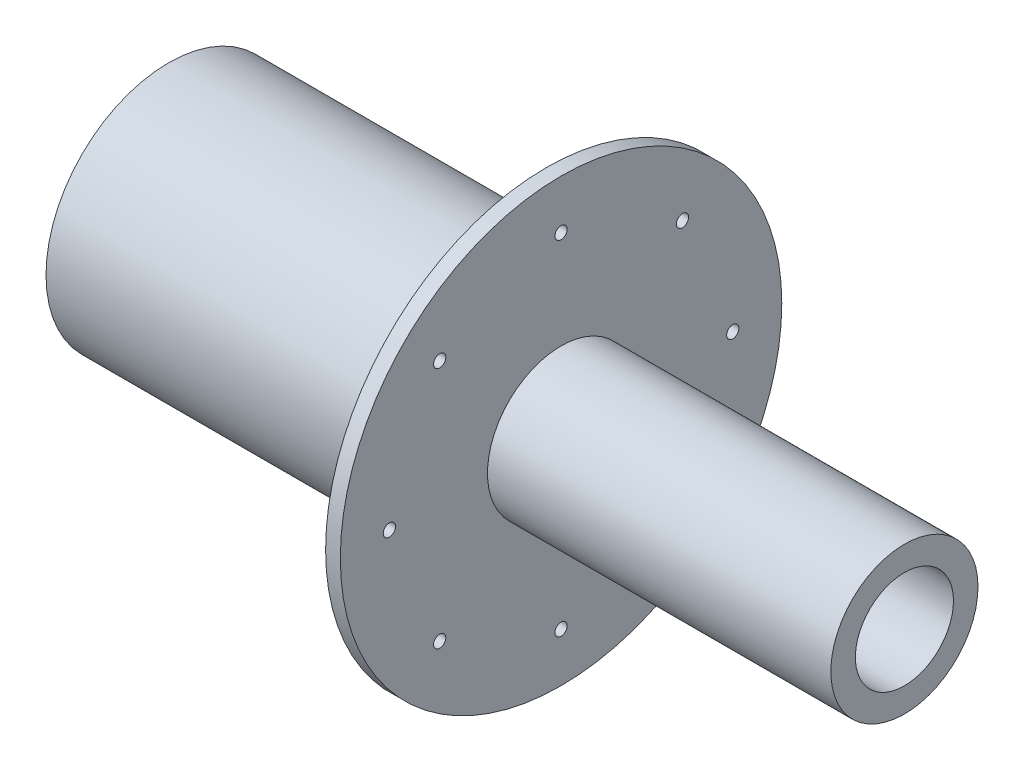
ISO-10303-21;
HEADER;
FILE_DESCRIPTION(('STEP AP214'),'2;1');
FILE_NAME('part.step','',(''),(''),'','','');
FILE_SCHEMA(('AUTOMOTIVE_DESIGN { 1 0 10303 214 1 1 1 1 }'));
ENDSEC;
DATA;
#1=APPLICATION_CONTEXT('core data for automotive mechanical design processes');
#2=APPLICATION_PROTOCOL_DEFINITION('international standard','automotive_design',2000,#1);
#3=PRODUCT_CONTEXT('',#1,'mechanical');
#4=PRODUCT('Part','Part','',(#3));
#5=PRODUCT_RELATED_PRODUCT_CATEGORY('part','',(#4));
#6=PRODUCT_DEFINITION_FORMATION('','',#4);
#7=PRODUCT_DEFINITION_CONTEXT('part definition',#1,'design');
#8=PRODUCT_DEFINITION('design','',#6,#7);
#9=PRODUCT_DEFINITION_SHAPE('','',#8);
#10=(LENGTH_UNIT() NAMED_UNIT(*) SI_UNIT(.MILLI.,.METRE.));
#11=(NAMED_UNIT(*) PLANE_ANGLE_UNIT() SI_UNIT($,.RADIAN.));
#12=(NAMED_UNIT(*) SI_UNIT($,.STERADIAN.) SOLID_ANGLE_UNIT());
#13=UNCERTAINTY_MEASURE_WITH_UNIT(LENGTH_MEASURE(1.E-05),#10,'distance_accuracy_value','');
#14=(GEOMETRIC_REPRESENTATION_CONTEXT(3) GLOBAL_UNCERTAINTY_ASSIGNED_CONTEXT((#13)) GLOBAL_UNIT_ASSIGNED_CONTEXT((#10,
#11,#12)) REPRESENTATION_CONTEXT('',''));
#15=CARTESIAN_POINT('',(0.,0.,0.));
#16=DIRECTION('',(0.,0.,1.));
#17=DIRECTION('',(1.,0.,0.));
#18=AXIS2_PLACEMENT_3D('',#15,#16,#17);
#19=CARTESIAN_POINT('',(-80.,0.,0.));
#20=DIRECTION('',(1.,0.,0.));
#21=DIRECTION('',(0.,0.,-1.));
#22=AXIS2_PLACEMENT_3D('',#19,#20,#21);
#23=CYLINDRICAL_SURFACE('',#22,25.);
#24=CARTESIAN_POINT('',(-80.,0.,0.));
#25=DIRECTION('',(1.,0.,0.));
#26=DIRECTION('',(0.,0.,-1.));
#27=AXIS2_PLACEMENT_3D('',#24,#25,#26);
#28=CIRCLE('',#27,25.);
#29=CARTESIAN_POINT('',(-80.,0.,-25.));
#30=VERTEX_POINT('',#29);
#31=EDGE_CURVE('E10',#30,#30,#28,.T.);
#32=ORIENTED_EDGE('',*,*,#31,.T.);
#33=EDGE_LOOP('',(#32));
#34=FACE_BOUND('',#33,.T.);
#35=CARTESIAN_POINT('',(-3.,0.,0.));
#36=DIRECTION('',(1.,0.,0.));
#37=DIRECTION('',(0.,0.,-1.));
#38=AXIS2_PLACEMENT_3D('',#35,#36,#37);
#39=CIRCLE('',#38,25.);
#40=CARTESIAN_POINT('',(-3.,0.,-25.));
#41=VERTEX_POINT('',#40);
#42=EDGE_CURVE('E163',#41,#41,#39,.T.);
#43=ORIENTED_EDGE('',*,*,#42,.F.);
#44=EDGE_LOOP('',(#43));
#45=FACE_BOUND('',#44,.T.);
#46=ADVANCED_FACE('F43',(#34,#45),#23,.T.);
#47=CARTESIAN_POINT('',(-80.,0.,0.));
#48=DIRECTION('',(1.,0.,0.));
#49=DIRECTION('',(0.,0.,-1.));
#50=AXIS2_PLACEMENT_3D('',#47,#48,#49);
#51=CYLINDRICAL_SURFACE('',#50,10.);
#52=CARTESIAN_POINT('',(-80.,0.,0.));
#53=DIRECTION('',(1.,0.,0.));
#54=DIRECTION('',(0.,0.,-1.));
#55=AXIS2_PLACEMENT_3D('',#52,#53,#54);
#56=CIRCLE('',#55,10.);
#57=CARTESIAN_POINT('',(-80.,0.,-10.));
#58=VERTEX_POINT('',#57);
#59=EDGE_CURVE('E52',#58,#58,#56,.T.);
#60=ORIENTED_EDGE('',*,*,#59,.F.);
#61=EDGE_LOOP('',(#60));
#62=FACE_BOUND('',#61,.T.);
#63=CARTESIAN_POINT('',(70.,0.,0.));
#64=DIRECTION('',(1.,0.,0.));
#65=DIRECTION('',(0.,0.,-1.));
#66=AXIS2_PLACEMENT_3D('',#63,#64,#65);
#67=CIRCLE('',#66,10.);
#68=CARTESIAN_POINT('',(70.,0.,-10.));
#69=VERTEX_POINT('',#68);
#70=EDGE_CURVE('E151',#69,#69,#67,.T.);
#71=ORIENTED_EDGE('',*,*,#70,.T.);
#72=EDGE_LOOP('',(#71));
#73=FACE_BOUND('',#72,.T.);
#74=ADVANCED_FACE('F45',(#62,#73),#51,.F.);
#75=CARTESIAN_POINT('',(-80.,0.,0.));
#76=DIRECTION('',(1.,0.,0.));
#77=DIRECTION('',(0.,0.,-1.));
#78=AXIS2_PLACEMENT_3D('',#75,#76,#77);
#79=PLANE('',#78);
#80=ORIENTED_EDGE('',*,*,#59,.T.);
#81=EDGE_LOOP('',(#80));
#82=FACE_BOUND('',#81,.T.);
#83=ORIENTED_EDGE('',*,*,#31,.F.);
#84=EDGE_LOOP('',(#83));
#85=FACE_BOUND('',#84,.T.);
#86=ADVANCED_FACE('F187',(#82,#85),#79,.F.);
#87=CARTESIAN_POINT('',(0.,0.,0.));
#88=DIRECTION('',(1.,0.,0.));
#89=DIRECTION('',(0.,0.,-1.));
#90=AXIS2_PLACEMENT_3D('',#87,#88,#89);
#91=PLANE('',#90);
#92=CARTESIAN_POINT('',(0.,0.,35.));
#93=DIRECTION('',(1.,0.,0.));
#94=DIRECTION('',(0.,0.,-1.));
#95=AXIS2_PLACEMENT_3D('',#92,#93,#94);
#96=CIRCLE('',#95,1.24999999999999);
#97=CARTESIAN_POINT('',(0.,0.,33.75));
#98=VERTEX_POINT('',#97);
#99=EDGE_CURVE('E47',#98,#98,#96,.T.);
#100=ORIENTED_EDGE('',*,*,#99,.F.);
#101=EDGE_LOOP('',(#100));
#102=FACE_BOUND('',#101,.T.);
#103=CARTESIAN_POINT('',(0.,35.,0.));
#104=DIRECTION('',(1.,0.,0.));
#105=DIRECTION('',(0.,0.,-1.));
#106=AXIS2_PLACEMENT_3D('',#103,#104,#105);
#107=CIRCLE('',#106,1.24999999999999);
#108=CARTESIAN_POINT('',(0.,35.,-1.24999999999999));
#109=VERTEX_POINT('',#108);
#110=EDGE_CURVE('E97',#109,#109,#107,.T.);
#111=ORIENTED_EDGE('',*,*,#110,.F.);
#112=EDGE_LOOP('',(#111));
#113=FACE_BOUND('',#112,.T.);
#114=CARTESIAN_POINT('',(0.,0.,-35.));
#115=DIRECTION('',(1.,0.,0.));
#116=DIRECTION('',(0.,0.,-1.));
#117=AXIS2_PLACEMENT_3D('',#114,#115,#116);
#118=CIRCLE('',#117,1.24999999999999);
#119=CARTESIAN_POINT('',(0.,0.,-36.25));
#120=VERTEX_POINT('',#119);
#121=EDGE_CURVE('E92',#120,#120,#118,.T.);
#122=ORIENTED_EDGE('',*,*,#121,.F.);
#123=EDGE_LOOP('',(#122));
#124=FACE_BOUND('',#123,.T.);
#125=CARTESIAN_POINT('',(0.,-35.,0.));
#126=DIRECTION('',(1.,0.,0.));
#127=DIRECTION('',(0.,0.,-1.));
#128=AXIS2_PLACEMENT_3D('',#125,#126,#127);
#129=CIRCLE('',#128,1.24999999999999);
#130=CARTESIAN_POINT('',(0.,-35.,-1.24999999999999));
#131=VERTEX_POINT('',#130);
#132=EDGE_CURVE('E86',#131,#131,#129,.T.);
#133=ORIENTED_EDGE('',*,*,#132,.F.);
#134=EDGE_LOOP('',(#133));
#135=FACE_BOUND('',#134,.T.);
#136=CARTESIAN_POINT('',(0.,24.7487373415294,24.748737341529));
#137=DIRECTION('',(1.,0.,0.));
#138=DIRECTION('',(0.,0.,-1.));
#139=AXIS2_PLACEMENT_3D('',#136,#137,#138);
#140=CIRCLE('',#139,1.24999999999999);
#141=CARTESIAN_POINT('',(0.,24.7487373415294,23.498737341529));
#142=VERTEX_POINT('',#141);
#143=EDGE_CURVE('E80',#142,#142,#140,.T.);
#144=ORIENTED_EDGE('',*,*,#143,.F.);
#145=EDGE_LOOP('',(#144));
#146=FACE_BOUND('',#145,.T.);
#147=CARTESIAN_POINT('',(0.,24.7487373415289,-24.7487373415294));
#148=DIRECTION('',(1.,0.,0.));
#149=DIRECTION('',(0.,0.,-1.));
#150=AXIS2_PLACEMENT_3D('',#147,#148,#149);
#151=CIRCLE('',#150,1.24999999999999);
#152=CARTESIAN_POINT('',(0.,24.7487373415289,-25.9987373415294));
#153=VERTEX_POINT('',#152);
#154=EDGE_CURVE('E74',#153,#153,#151,.T.);
#155=ORIENTED_EDGE('',*,*,#154,.F.);
#156=EDGE_LOOP('',(#155));
#157=FACE_BOUND('',#156,.T.);
#158=CARTESIAN_POINT('',(0.,-24.7487373415294,-24.748737341529));
#159=DIRECTION('',(1.,0.,0.));
#160=DIRECTION('',(0.,0.,-1.));
#161=AXIS2_PLACEMENT_3D('',#158,#159,#160);
#162=CIRCLE('',#161,1.24999999999999);
#163=CARTESIAN_POINT('',(0.,-24.7487373415294,-25.998737341529));
#164=VERTEX_POINT('',#163);
#165=EDGE_CURVE('E68',#164,#164,#162,.T.);
#166=ORIENTED_EDGE('',*,*,#165,.F.);
#167=EDGE_LOOP('',(#166));
#168=FACE_BOUND('',#167,.T.);
#169=CARTESIAN_POINT('',(0.,-24.748737341529,24.7487373415294));
#170=DIRECTION('',(1.,0.,0.));
#171=DIRECTION('',(0.,0.,-1.));
#172=AXIS2_PLACEMENT_3D('',#169,#170,#171);
#173=CIRCLE('',#172,1.24999999999999);
#174=CARTESIAN_POINT('',(0.,-24.748737341529,23.4987373415294));
#175=VERTEX_POINT('',#174);
#176=EDGE_CURVE('E62',#175,#175,#173,.T.);
#177=ORIENTED_EDGE('',*,*,#176,.F.);
#178=EDGE_LOOP('',(#177));
#179=FACE_BOUND('',#178,.T.);
#180=CARTESIAN_POINT('',(0.,0.,0.));
#181=DIRECTION('',(1.,0.,0.));
#182=DIRECTION('',(0.,0.,-1.));
#183=AXIS2_PLACEMENT_3D('',#180,#181,#182);
#184=CIRCLE('',#183,15.);
#185=CARTESIAN_POINT('',(0.,0.,-15.));
#186=VERTEX_POINT('',#185);
#187=EDGE_CURVE('E66',#186,#186,#184,.T.);
#188=ORIENTED_EDGE('',*,*,#187,.F.);
#189=EDGE_LOOP('',(#188));
#190=FACE_BOUND('',#189,.T.);
#191=CARTESIAN_POINT('',(0.,0.,0.));
#192=DIRECTION('',(1.,0.,0.));
#193=DIRECTION('',(0.,0.,-1.));
#194=AXIS2_PLACEMENT_3D('',#191,#192,#193);
#195=CIRCLE('',#194,45.);
#196=CARTESIAN_POINT('',(0.,0.,-45.));
#197=VERTEX_POINT('',#196);
#198=EDGE_CURVE('E159',#197,#197,#195,.T.);
#199=ORIENTED_EDGE('',*,*,#198,.T.);
#200=EDGE_LOOP('',(#199));
#201=FACE_BOUND('',#200,.T.);
#202=ADVANCED_FACE('F173',(#102,#113,#124,#135,#146,#157,#168,#179,#190,#201),#91,.T.);
#203=CARTESIAN_POINT('',(-3.,0.,0.));
#204=DIRECTION('',(1.,0.,0.));
#205=DIRECTION('',(0.,0.,-1.));
#206=AXIS2_PLACEMENT_3D('',#203,#204,#205);
#207=CYLINDRICAL_SURFACE('',#206,45.);
#208=CARTESIAN_POINT('',(-3.,0.,0.));
#209=DIRECTION('',(1.,0.,0.));
#210=DIRECTION('',(0.,0.,-1.));
#211=AXIS2_PLACEMENT_3D('',#208,#209,#210);
#212=CIRCLE('',#211,45.);
#213=CARTESIAN_POINT('',(-3.,0.,-45.));
#214=VERTEX_POINT('',#213);
#215=EDGE_CURVE('E58',#214,#214,#212,.T.);
#216=ORIENTED_EDGE('',*,*,#215,.T.);
#217=EDGE_LOOP('',(#216));
#218=FACE_BOUND('',#217,.T.);
#219=ORIENTED_EDGE('',*,*,#198,.F.);
#220=EDGE_LOOP('',(#219));
#221=FACE_BOUND('',#220,.T.);
#222=ADVANCED_FACE('F175',(#218,#221),#207,.T.);
#223=CARTESIAN_POINT('',(-3.,0.,0.));
#224=DIRECTION('',(1.,0.,0.));
#225=DIRECTION('',(0.,0.,-1.));
#226=AXIS2_PLACEMENT_3D('',#223,#224,#225);
#227=PLANE('',#226);
#228=CARTESIAN_POINT('',(-3.,0.,35.));
#229=DIRECTION('',(-1.,0.,0.));
#230=DIRECTION('',(0.,0.,1.));
#231=AXIS2_PLACEMENT_3D('',#228,#229,#230);
#232=CIRCLE('',#231,1.525);
#233=CARTESIAN_POINT('',(-3.,0.,36.525));
#234=VERTEX_POINT('',#233);
#235=EDGE_CURVE('E290',#234,#234,#232,.T.);
#236=ORIENTED_EDGE('',*,*,#235,.F.);
#237=EDGE_LOOP('',(#236));
#238=FACE_BOUND('',#237,.T.);
#239=CARTESIAN_POINT('',(-3.,35.,0.));
#240=DIRECTION('',(-1.,0.,0.));
#241=DIRECTION('',(0.,0.,1.));
#242=AXIS2_PLACEMENT_3D('',#239,#240,#241);
#243=CIRCLE('',#242,1.525);
#244=CARTESIAN_POINT('',(-3.,35.,1.525));
#245=VERTEX_POINT('',#244);
#246=EDGE_CURVE('E109',#245,#245,#243,.T.);
#247=ORIENTED_EDGE('',*,*,#246,.F.);
#248=EDGE_LOOP('',(#247));
#249=FACE_BOUND('',#248,.T.);
#250=CARTESIAN_POINT('',(-3.,0.,-35.));
#251=DIRECTION('',(-1.,0.,0.));
#252=DIRECTION('',(0.,0.,1.));
#253=AXIS2_PLACEMENT_3D('',#250,#251,#252);
#254=CIRCLE('',#253,1.525);
#255=CARTESIAN_POINT('',(-3.,0.,-33.475));
#256=VERTEX_POINT('',#255);
#257=EDGE_CURVE('E100',#256,#256,#254,.T.);
#258=ORIENTED_EDGE('',*,*,#257,.F.);
#259=EDGE_LOOP('',(#258));
#260=FACE_BOUND('',#259,.T.);
#261=CARTESIAN_POINT('',(-3.,-35.,0.));
#262=DIRECTION('',(-1.,0.,0.));
#263=DIRECTION('',(0.,0.,1.));
#264=AXIS2_PLACEMENT_3D('',#261,#262,#263);
#265=CIRCLE('',#264,1.525);
#266=CARTESIAN_POINT('',(-3.,-35.,1.525));
#267=VERTEX_POINT('',#266);
#268=EDGE_CURVE('E95',#267,#267,#265,.T.);
#269=ORIENTED_EDGE('',*,*,#268,.F.);
#270=EDGE_LOOP('',(#269));
#271=FACE_BOUND('',#270,.T.);
#272=CARTESIAN_POINT('',(-3.,24.7487373415294,24.748737341529));
#273=DIRECTION('',(-1.,0.,0.));
#274=DIRECTION('',(0.,0.,1.));
#275=AXIS2_PLACEMENT_3D('',#272,#273,#274);
#276=CIRCLE('',#275,1.525);
#277=CARTESIAN_POINT('',(-3.,24.7487373415294,26.273737341529));
#278=VERTEX_POINT('',#277);
#279=EDGE_CURVE('E90',#278,#278,#276,.T.);
#280=ORIENTED_EDGE('',*,*,#279,.F.);
#281=EDGE_LOOP('',(#280));
#282=FACE_BOUND('',#281,.T.);
#283=CARTESIAN_POINT('',(-3.,24.7487373415289,-24.7487373415294));
#284=DIRECTION('',(-1.,0.,0.));
#285=DIRECTION('',(0.,0.,1.));
#286=AXIS2_PLACEMENT_3D('',#283,#284,#285);
#287=CIRCLE('',#286,1.525);
#288=CARTESIAN_POINT('',(-3.,24.7487373415289,-23.2237373415294));
#289=VERTEX_POINT('',#288);
#290=EDGE_CURVE('E84',#289,#289,#287,.T.);
#291=ORIENTED_EDGE('',*,*,#290,.F.);
#292=EDGE_LOOP('',(#291));
#293=FACE_BOUND('',#292,.T.);
#294=CARTESIAN_POINT('',(-3.,-24.7487373415294,-24.748737341529));
#295=DIRECTION('',(-1.,0.,0.));
#296=DIRECTION('',(0.,0.,1.));
#297=AXIS2_PLACEMENT_3D('',#294,#295,#296);
#298=CIRCLE('',#297,1.525);
#299=CARTESIAN_POINT('',(-3.,-24.7487373415294,-23.223737341529));
#300=VERTEX_POINT('',#299);
#301=EDGE_CURVE('E78',#300,#300,#298,.T.);
#302=ORIENTED_EDGE('',*,*,#301,.F.);
#303=EDGE_LOOP('',(#302));
#304=FACE_BOUND('',#303,.T.);
#305=CARTESIAN_POINT('',(-3.,-24.748737341529,24.7487373415294));
#306=DIRECTION('',(-1.,0.,0.));
#307=DIRECTION('',(0.,0.,1.));
#308=AXIS2_PLACEMENT_3D('',#305,#306,#307);
#309=CIRCLE('',#308,1.525);
#310=CARTESIAN_POINT('',(-3.,-24.748737341529,26.2737373415294));
#311=VERTEX_POINT('',#310);
#312=EDGE_CURVE('E72',#311,#311,#309,.T.);
#313=ORIENTED_EDGE('',*,*,#312,.F.);
#314=EDGE_LOOP('',(#313));
#315=FACE_BOUND('',#314,.T.);
#316=ORIENTED_EDGE('',*,*,#42,.T.);
#317=EDGE_LOOP('',(#316));
#318=FACE_BOUND('',#317,.T.);
#319=ORIENTED_EDGE('',*,*,#215,.F.);
#320=EDGE_LOOP('',(#319));
#321=FACE_BOUND('',#320,.T.);
#322=ADVANCED_FACE('F177',(#238,#249,#260,#271,#282,#293,#304,#315,#318,#321),#227,.F.);
#323=CARTESIAN_POINT('',(70.,0.,0.));
#324=DIRECTION('',(-1.,0.,0.));
#325=DIRECTION('',(0.,0.,1.));
#326=AXIS2_PLACEMENT_3D('',#323,#324,#325);
#327=CYLINDRICAL_SURFACE('',#326,15.);
#328=CARTESIAN_POINT('',(70.,0.,0.));
#329=DIRECTION('',(1.,0.,0.));
#330=DIRECTION('',(0.,0.,-1.));
#331=AXIS2_PLACEMENT_3D('',#328,#329,#330);
#332=CIRCLE('',#331,15.);
#333=CARTESIAN_POINT('',(70.,0.,-15.));
#334=VERTEX_POINT('',#333);
#335=EDGE_CURVE('E155',#334,#334,#332,.T.);
#336=ORIENTED_EDGE('',*,*,#335,.F.);
#337=EDGE_LOOP('',(#336));
#338=FACE_BOUND('',#337,.T.);
#339=ORIENTED_EDGE('',*,*,#187,.T.);
#340=EDGE_LOOP('',(#339));
#341=FACE_BOUND('',#340,.T.);
#342=ADVANCED_FACE('F184',(#338,#341),#327,.T.);
#343=CARTESIAN_POINT('',(70.,0.,0.));
#344=DIRECTION('',(1.,0.,0.));
#345=DIRECTION('',(0.,0.,-1.));
#346=AXIS2_PLACEMENT_3D('',#343,#344,#345);
#347=PLANE('',#346);
#348=ORIENTED_EDGE('',*,*,#70,.F.);
#349=EDGE_LOOP('',(#348));
#350=FACE_BOUND('',#349,.T.);
#351=ORIENTED_EDGE('',*,*,#335,.T.);
#352=EDGE_LOOP('',(#351));
#353=FACE_BOUND('',#352,.T.);
#354=ADVANCED_FACE('F206',(#350,#353),#347,.T.);
#355=CARTESIAN_POINT('',(-3.,-24.748737341529,24.7487373415294));
#356=DIRECTION('',(-1.,0.,0.));
#357=DIRECTION('',(0.,0.,1.));
#358=AXIS2_PLACEMENT_3D('',#355,#356,#357);
#359=CYLINDRICAL_SURFACE('',#358,1.24999999999999);
#360=ORIENTED_EDGE('',*,*,#176,.T.);
#361=EDGE_LOOP('',(#360));
#362=FACE_BOUND('',#361,.T.);
#363=CARTESIAN_POINT('',(-2.725,-24.748737341529,24.7487373415294));
#364=DIRECTION('',(-1.,0.,0.));
#365=DIRECTION('',(0.,0.,1.));
#366=AXIS2_PLACEMENT_3D('',#363,#364,#365);
#367=CIRCLE('',#366,1.25);
#368=CARTESIAN_POINT('',(-2.725,-24.748737341529,25.9987373415294));
#369=VERTEX_POINT('',#368);
#370=EDGE_CURVE('E67',#369,#369,#367,.T.);
#371=ORIENTED_EDGE('',*,*,#370,.T.);
#372=EDGE_LOOP('',(#371));
#373=FACE_BOUND('',#372,.T.);
#374=ADVANCED_FACE('F209',(#362,#373),#359,.F.);
#375=CARTESIAN_POINT('',(-3.,-24.748737341529,24.7487373415294));
#376=DIRECTION('',(-1.,0.,0.));
#377=DIRECTION('',(0.,0.,1.));
#378=AXIS2_PLACEMENT_3D('',#375,#376,#377);
#379=CONICAL_SURFACE('',#378,1.525,0.785398163397445);
#380=ORIENTED_EDGE('',*,*,#370,.F.);
#381=EDGE_LOOP('',(#380));
#382=FACE_BOUND('',#381,.T.);
#383=ORIENTED_EDGE('',*,*,#312,.T.);
#384=EDGE_LOOP('',(#383));
#385=FACE_BOUND('',#384,.T.);
#386=ADVANCED_FACE('F223',(#382,#385),#379,.F.);
#387=CARTESIAN_POINT('',(-3.,-24.7487373415294,-24.748737341529));
#388=DIRECTION('',(-1.,0.,0.));
#389=DIRECTION('',(0.,0.,1.));
#390=AXIS2_PLACEMENT_3D('',#387,#388,#389);
#391=CYLINDRICAL_SURFACE('',#390,1.24999999999999);
#392=ORIENTED_EDGE('',*,*,#165,.T.);
#393=EDGE_LOOP('',(#392));
#394=FACE_BOUND('',#393,.T.);
#395=CARTESIAN_POINT('',(-2.725,-24.7487373415294,-24.748737341529));
#396=DIRECTION('',(-1.,0.,0.));
#397=DIRECTION('',(0.,0.,1.));
#398=AXIS2_PLACEMENT_3D('',#395,#396,#397);
#399=CIRCLE('',#398,1.25);
#400=CARTESIAN_POINT('',(-2.725,-24.7487373415294,-23.498737341529));
#401=VERTEX_POINT('',#400);
#402=EDGE_CURVE('E73',#401,#401,#399,.T.);
#403=ORIENTED_EDGE('',*,*,#402,.T.);
#404=EDGE_LOOP('',(#403));
#405=FACE_BOUND('',#404,.T.);
#406=ADVANCED_FACE('F227',(#394,#405),#391,.F.);
#407=CARTESIAN_POINT('',(-3.,-24.7487373415294,-24.748737341529));
#408=DIRECTION('',(-1.,0.,0.));
#409=DIRECTION('',(0.,0.,1.));
#410=AXIS2_PLACEMENT_3D('',#407,#408,#409);
#411=CONICAL_SURFACE('',#410,1.525,0.785398163397445);
#412=ORIENTED_EDGE('',*,*,#402,.F.);
#413=EDGE_LOOP('',(#412));
#414=FACE_BOUND('',#413,.T.);
#415=ORIENTED_EDGE('',*,*,#301,.T.);
#416=EDGE_LOOP('',(#415));
#417=FACE_BOUND('',#416,.T.);
#418=ADVANCED_FACE('F231',(#414,#417),#411,.F.);
#419=CARTESIAN_POINT('',(-3.,24.7487373415289,-24.7487373415294));
#420=DIRECTION('',(-1.,0.,0.));
#421=DIRECTION('',(0.,0.,1.));
#422=AXIS2_PLACEMENT_3D('',#419,#420,#421);
#423=CYLINDRICAL_SURFACE('',#422,1.24999999999999);
#424=ORIENTED_EDGE('',*,*,#154,.T.);
#425=EDGE_LOOP('',(#424));
#426=FACE_BOUND('',#425,.T.);
#427=CARTESIAN_POINT('',(-2.725,24.7487373415289,-24.7487373415294));
#428=DIRECTION('',(-1.,0.,0.));
#429=DIRECTION('',(0.,0.,1.));
#430=AXIS2_PLACEMENT_3D('',#427,#428,#429);
#431=CIRCLE('',#430,1.25);
#432=CARTESIAN_POINT('',(-2.725,24.7487373415289,-23.4987373415294));
#433=VERTEX_POINT('',#432);
#434=EDGE_CURVE('E79',#433,#433,#431,.T.);
#435=ORIENTED_EDGE('',*,*,#434,.T.);
#436=EDGE_LOOP('',(#435));
#437=FACE_BOUND('',#436,.T.);
#438=ADVANCED_FACE('F235',(#426,#437),#423,.F.);
#439=CARTESIAN_POINT('',(-3.,24.7487373415289,-24.7487373415294));
#440=DIRECTION('',(-1.,0.,0.));
#441=DIRECTION('',(0.,0.,1.));
#442=AXIS2_PLACEMENT_3D('',#439,#440,#441);
#443=CONICAL_SURFACE('',#442,1.525,0.785398163397445);
#444=ORIENTED_EDGE('',*,*,#434,.F.);
#445=EDGE_LOOP('',(#444));
#446=FACE_BOUND('',#445,.T.);
#447=ORIENTED_EDGE('',*,*,#290,.T.);
#448=EDGE_LOOP('',(#447));
#449=FACE_BOUND('',#448,.T.);
#450=ADVANCED_FACE('F239',(#446,#449),#443,.F.);
#451=CARTESIAN_POINT('',(-3.,24.7487373415294,24.748737341529));
#452=DIRECTION('',(-1.,0.,0.));
#453=DIRECTION('',(0.,0.,1.));
#454=AXIS2_PLACEMENT_3D('',#451,#452,#453);
#455=CYLINDRICAL_SURFACE('',#454,1.24999999999999);
#456=ORIENTED_EDGE('',*,*,#143,.T.);
#457=EDGE_LOOP('',(#456));
#458=FACE_BOUND('',#457,.T.);
#459=CARTESIAN_POINT('',(-2.725,24.7487373415294,24.748737341529));
#460=DIRECTION('',(-1.,0.,0.));
#461=DIRECTION('',(0.,0.,1.));
#462=AXIS2_PLACEMENT_3D('',#459,#460,#461);
#463=CIRCLE('',#462,1.25);
#464=CARTESIAN_POINT('',(-2.725,24.7487373415294,25.998737341529));
#465=VERTEX_POINT('',#464);
#466=EDGE_CURVE('E85',#465,#465,#463,.T.);
#467=ORIENTED_EDGE('',*,*,#466,.T.);
#468=EDGE_LOOP('',(#467));
#469=FACE_BOUND('',#468,.T.);
#470=ADVANCED_FACE('F243',(#458,#469),#455,.F.);
#471=CARTESIAN_POINT('',(-3.,24.7487373415294,24.748737341529));
#472=DIRECTION('',(-1.,0.,0.));
#473=DIRECTION('',(0.,0.,1.));
#474=AXIS2_PLACEMENT_3D('',#471,#472,#473);
#475=CONICAL_SURFACE('',#474,1.525,0.785398163397445);
#476=ORIENTED_EDGE('',*,*,#466,.F.);
#477=EDGE_LOOP('',(#476));
#478=FACE_BOUND('',#477,.T.);
#479=ORIENTED_EDGE('',*,*,#279,.T.);
#480=EDGE_LOOP('',(#479));
#481=FACE_BOUND('',#480,.T.);
#482=ADVANCED_FACE('F247',(#478,#481),#475,.F.);
#483=CARTESIAN_POINT('',(-3.,-35.,0.));
#484=DIRECTION('',(-1.,0.,0.));
#485=DIRECTION('',(0.,0.,1.));
#486=AXIS2_PLACEMENT_3D('',#483,#484,#485);
#487=CYLINDRICAL_SURFACE('',#486,1.24999999999999);
#488=ORIENTED_EDGE('',*,*,#132,.T.);
#489=EDGE_LOOP('',(#488));
#490=FACE_BOUND('',#489,.T.);
#491=CARTESIAN_POINT('',(-2.725,-35.,0.));
#492=DIRECTION('',(-1.,0.,0.));
#493=DIRECTION('',(0.,0.,1.));
#494=AXIS2_PLACEMENT_3D('',#491,#492,#493);
#495=CIRCLE('',#494,1.25);
#496=CARTESIAN_POINT('',(-2.725,-35.,1.25));
#497=VERTEX_POINT('',#496);
#498=EDGE_CURVE('E91',#497,#497,#495,.T.);
#499=ORIENTED_EDGE('',*,*,#498,.T.);
#500=EDGE_LOOP('',(#499));
#501=FACE_BOUND('',#500,.T.);
#502=ADVANCED_FACE('F251',(#490,#501),#487,.F.);
#503=CARTESIAN_POINT('',(-3.,-35.,0.));
#504=DIRECTION('',(-1.,0.,0.));
#505=DIRECTION('',(0.,0.,1.));
#506=AXIS2_PLACEMENT_3D('',#503,#504,#505);
#507=CONICAL_SURFACE('',#506,1.525,0.785398163397439);
#508=ORIENTED_EDGE('',*,*,#498,.F.);
#509=EDGE_LOOP('',(#508));
#510=FACE_BOUND('',#509,.T.);
#511=ORIENTED_EDGE('',*,*,#268,.T.);
#512=EDGE_LOOP('',(#511));
#513=FACE_BOUND('',#512,.T.);
#514=ADVANCED_FACE('F255',(#510,#513),#507,.F.);
#515=CARTESIAN_POINT('',(-3.,0.,-35.));
#516=DIRECTION('',(-1.,0.,0.));
#517=DIRECTION('',(0.,0.,1.));
#518=AXIS2_PLACEMENT_3D('',#515,#516,#517);
#519=CYLINDRICAL_SURFACE('',#518,1.24999999999999);
#520=ORIENTED_EDGE('',*,*,#121,.T.);
#521=EDGE_LOOP('',(#520));
#522=FACE_BOUND('',#521,.T.);
#523=CARTESIAN_POINT('',(-2.725,0.,-35.));
#524=DIRECTION('',(-1.,0.,0.));
#525=DIRECTION('',(0.,0.,1.));
#526=AXIS2_PLACEMENT_3D('',#523,#524,#525);
#527=CIRCLE('',#526,1.25);
#528=CARTESIAN_POINT('',(-2.725,0.,-33.75));
#529=VERTEX_POINT('',#528);
#530=EDGE_CURVE('E96',#529,#529,#527,.T.);
#531=ORIENTED_EDGE('',*,*,#530,.T.);
#532=EDGE_LOOP('',(#531));
#533=FACE_BOUND('',#532,.T.);
#534=ADVANCED_FACE('F259',(#522,#533),#519,.F.);
#535=CARTESIAN_POINT('',(-3.,0.,-35.));
#536=DIRECTION('',(-1.,0.,0.));
#537=DIRECTION('',(0.,0.,1.));
#538=AXIS2_PLACEMENT_3D('',#535,#536,#537);
#539=CONICAL_SURFACE('',#538,1.525,0.785398163397446);
#540=ORIENTED_EDGE('',*,*,#530,.F.);
#541=EDGE_LOOP('',(#540));
#542=FACE_BOUND('',#541,.T.);
#543=ORIENTED_EDGE('',*,*,#257,.T.);
#544=EDGE_LOOP('',(#543));
#545=FACE_BOUND('',#544,.T.);
#546=ADVANCED_FACE('F263',(#542,#545),#539,.F.);
#547=CARTESIAN_POINT('',(-3.,35.,0.));
#548=DIRECTION('',(-1.,0.,0.));
#549=DIRECTION('',(0.,0.,1.));
#550=AXIS2_PLACEMENT_3D('',#547,#548,#549);
#551=CYLINDRICAL_SURFACE('',#550,1.24999999999999);
#552=ORIENTED_EDGE('',*,*,#110,.T.);
#553=EDGE_LOOP('',(#552));
#554=FACE_BOUND('',#553,.T.);
#555=CARTESIAN_POINT('',(-2.725,35.,0.));
#556=DIRECTION('',(-1.,0.,0.));
#557=DIRECTION('',(0.,0.,1.));
#558=AXIS2_PLACEMENT_3D('',#555,#556,#557);
#559=CIRCLE('',#558,1.25);
#560=CARTESIAN_POINT('',(-2.725,35.,1.25));
#561=VERTEX_POINT('',#560);
#562=EDGE_CURVE('E101',#561,#561,#559,.T.);
#563=ORIENTED_EDGE('',*,*,#562,.T.);
#564=EDGE_LOOP('',(#563));
#565=FACE_BOUND('',#564,.T.);
#566=ADVANCED_FACE('F267',(#554,#565),#551,.F.);
#567=CARTESIAN_POINT('',(-3.,35.,0.));
#568=DIRECTION('',(-1.,0.,0.));
#569=DIRECTION('',(0.,0.,1.));
#570=AXIS2_PLACEMENT_3D('',#567,#568,#569);
#571=CONICAL_SURFACE('',#570,1.525,0.785398163397439);
#572=ORIENTED_EDGE('',*,*,#562,.F.);
#573=EDGE_LOOP('',(#572));
#574=FACE_BOUND('',#573,.T.);
#575=ORIENTED_EDGE('',*,*,#246,.T.);
#576=EDGE_LOOP('',(#575));
#577=FACE_BOUND('',#576,.T.);
#578=ADVANCED_FACE('F271',(#574,#577),#571,.F.);
#579=CARTESIAN_POINT('',(-3.,0.,35.));
#580=DIRECTION('',(-1.,0.,0.));
#581=DIRECTION('',(0.,0.,1.));
#582=AXIS2_PLACEMENT_3D('',#579,#580,#581);
#583=CYLINDRICAL_SURFACE('',#582,1.24999999999999);
#584=ORIENTED_EDGE('',*,*,#99,.T.);
#585=EDGE_LOOP('',(#584));
#586=FACE_BOUND('',#585,.T.);
#587=CARTESIAN_POINT('',(-2.725,0.,35.));
#588=DIRECTION('',(-1.,0.,0.));
#589=DIRECTION('',(0.,0.,1.));
#590=AXIS2_PLACEMENT_3D('',#587,#588,#589);
#591=CIRCLE('',#590,1.25);
#592=CARTESIAN_POINT('',(-2.725,0.,36.25));
#593=VERTEX_POINT('',#592);
#594=EDGE_CURVE('E287',#593,#593,#591,.T.);
#595=ORIENTED_EDGE('',*,*,#594,.T.);
#596=EDGE_LOOP('',(#595));
#597=FACE_BOUND('',#596,.T.);
#598=ADVANCED_FACE('F274',(#586,#597),#583,.F.);
#599=CARTESIAN_POINT('',(-3.,0.,35.));
#600=DIRECTION('',(-1.,0.,0.));
#601=DIRECTION('',(0.,0.,1.));
#602=AXIS2_PLACEMENT_3D('',#599,#600,#601);
#603=CONICAL_SURFACE('',#602,1.525,0.785398163397446);
#604=ORIENTED_EDGE('',*,*,#594,.F.);
#605=EDGE_LOOP('',(#604));
#606=FACE_BOUND('',#605,.T.);
#607=ORIENTED_EDGE('',*,*,#235,.T.);
#608=EDGE_LOOP('',(#607));
#609=FACE_BOUND('',#608,.T.);
#610=ADVANCED_FACE('F278',(#606,#609),#603,.F.);
#611=CLOSED_SHELL('',(#46,#74,#86,#202,#222,#322,#342,#354,#374,#386,#406,#418,#438,#450,#470,
#482,#502,#514,#534,#546,#566,#578,#598,#610));
#612=MANIFOLD_SOLID_BREP('B2',#611);
#613=ADVANCED_BREP_SHAPE_REPRESENTATION('',(#18,#612),#14);
#614=SHAPE_DEFINITION_REPRESENTATION(#9,#613);
ENDSEC;
END-ISO-10303-21;
